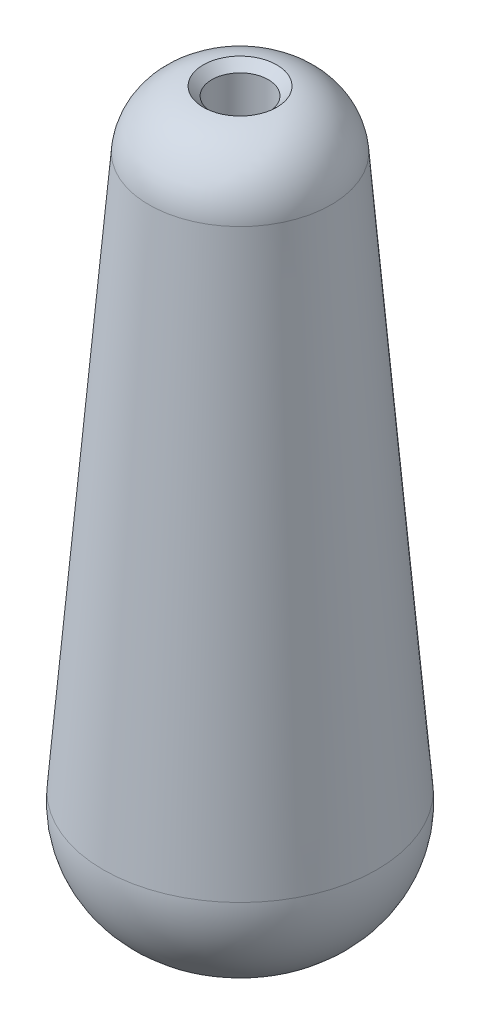
ISO-10303-21;
HEADER;
FILE_DESCRIPTION(('STEP AP214'),'2;1');
FILE_NAME('part.step','',(''),(''),'','','');
FILE_SCHEMA(('AUTOMOTIVE_DESIGN { 1 0 10303 214 1 1 1 1 }'));
ENDSEC;
DATA;
#1=APPLICATION_CONTEXT('core data for automotive mechanical design processes');
#2=APPLICATION_PROTOCOL_DEFINITION('international standard','automotive_design',2000,#1);
#3=PRODUCT_CONTEXT('',#1,'mechanical');
#4=PRODUCT('Part','Part','',(#3));
#5=PRODUCT_RELATED_PRODUCT_CATEGORY('part','',(#4));
#6=PRODUCT_DEFINITION_FORMATION('','',#4);
#7=PRODUCT_DEFINITION_CONTEXT('part definition',#1,'design');
#8=PRODUCT_DEFINITION('design','',#6,#7);
#9=PRODUCT_DEFINITION_SHAPE('','',#8);
#10=(LENGTH_UNIT() NAMED_UNIT(*) SI_UNIT(.MILLI.,.METRE.));
#11=(NAMED_UNIT(*) PLANE_ANGLE_UNIT() SI_UNIT($,.RADIAN.));
#12=(NAMED_UNIT(*) SI_UNIT($,.STERADIAN.) SOLID_ANGLE_UNIT());
#13=UNCERTAINTY_MEASURE_WITH_UNIT(LENGTH_MEASURE(1.E-05),#10,'distance_accuracy_value','');
#14=(GEOMETRIC_REPRESENTATION_CONTEXT(3) GLOBAL_UNCERTAINTY_ASSIGNED_CONTEXT((#13)) GLOBAL_UNIT_ASSIGNED_CONTEXT((#10,
#11,#12)) REPRESENTATION_CONTEXT('',''));
#15=CARTESIAN_POINT('',(0.,0.,0.));
#16=DIRECTION('',(0.,0.,1.));
#17=DIRECTION('',(1.,0.,0.));
#18=AXIS2_PLACEMENT_3D('',#15,#16,#17);
#19=CARTESIAN_POINT('',(3.1,0.,0.));
#20=DIRECTION('',(0.,-1.,0.));
#21=DIRECTION('',(0.,0.,-1.));
#22=AXIS2_PLACEMENT_3D('',#19,#20,#21);
#23=PLANE('',#22);
#24=CARTESIAN_POINT('',(0.,0.,0.));
#25=DIRECTION('',(0.,-1.,0.));
#26=DIRECTION('',(0.,0.,-1.));
#27=AXIS2_PLACEMENT_3D('',#24,#25,#26);
#28=CIRCLE('',#27,3.1);
#29=CARTESIAN_POINT('',(0.,0.,-3.1));
#30=VERTEX_POINT('',#29);
#31=EDGE_CURVE('E42',#30,#30,#28,.T.);
#32=ORIENTED_EDGE('',*,*,#31,.T.);
#33=EDGE_LOOP('',(#32));
#34=FACE_BOUND('',#33,.T.);
#35=ADVANCED_FACE('F31',(#34),#23,.T.);
#36=CARTESIAN_POINT('',(0.,11.9402709811617,0.));
#37=DIRECTION('',(0.,-1.,0.));
#38=DIRECTION('',(0.,0.,-1.));
#39=AXIS2_PLACEMENT_3D('',#36,#37,#38);
#40=DEGENERATE_TOROIDAL_SURFACE('',#39,3.1,11.9402709811617,.T.);
#41=CARTESIAN_POINT('',(0.,12.9201031624934,0.));
#42=DIRECTION('',(0.,-1.,0.));
#43=DIRECTION('',(0.,0.,-1.));
#44=AXIS2_PLACEMENT_3D('',#41,#42,#43);
#45=CIRCLE('',#44,15.);
#46=CARTESIAN_POINT('',(0.,12.9201031624934,-15.));
#47=VERTEX_POINT('',#46);
#48=EDGE_CURVE('E46',#47,#47,#45,.T.);
#49=ORIENTED_EDGE('',*,*,#48,.T.);
#50=EDGE_LOOP('',(#49));
#51=FACE_BOUND('',#50,.T.);
#52=ORIENTED_EDGE('',*,*,#31,.F.);
#53=EDGE_LOOP('',(#52));
#54=FACE_BOUND('',#53,.T.);
#55=ADVANCED_FACE('F71',(#51,#54),#40,.T.);
#56=CARTESIAN_POINT('',(0.,12.9201031624934,0.));
#57=DIRECTION('',(0.,-1.,0.));
#58=DIRECTION('',(0.,0.,-1.));
#59=AXIS2_PLACEMENT_3D('',#56,#57,#58);
#60=CONICAL_SURFACE('',#59,15.,0.0821535149347935);
#61=CARTESIAN_POINT('',(0.,73.6447875866532,0.));
#62=DIRECTION('',(0.,-1.,0.));
#63=DIRECTION('',(0.,0.,-1.));
#64=AXIS2_PLACEMENT_3D('',#61,#62,#63);
#65=CIRCLE('',#64,10.);
#66=CARTESIAN_POINT('',(0.,73.6447875866532,-10.));
#67=VERTEX_POINT('',#66);
#68=EDGE_CURVE('E51',#67,#67,#65,.T.);
#69=ORIENTED_EDGE('',*,*,#68,.T.);
#70=EDGE_LOOP('',(#69));
#71=FACE_BOUND('',#70,.T.);
#72=ORIENTED_EDGE('',*,*,#48,.F.);
#73=EDGE_LOOP('',(#72));
#74=FACE_BOUND('',#73,.T.);
#75=ADVANCED_FACE('F76',(#71,#74),#60,.T.);
#76=CARTESIAN_POINT('',(0.,73.0766495991583,0.));
#77=DIRECTION('',(0.,-1.,0.));
#78=DIRECTION('',(0.,0.,-1.));
#79=AXIS2_PLACEMENT_3D('',#76,#77,#78);
#80=DEGENERATE_TOROIDAL_SURFACE('',#79,3.1,6.92335040084168,.T.);
#81=CARTESIAN_POINT('',(0.,79.9363846238545,0.));
#82=DIRECTION('',(0.,-1.,0.));
#83=DIRECTION('',(0.,0.,-1.));
#84=AXIS2_PLACEMENT_3D('',#81,#82,#83);
#85=CIRCLE('',#84,4.0363846238545);
#86=CARTESIAN_POINT('',(0.,79.9363846238545,-4.0363846238545));
#87=VERTEX_POINT('',#86);
#88=EDGE_CURVE('E38',#87,#87,#85,.T.);
#89=ORIENTED_EDGE('',*,*,#88,.T.);
#90=EDGE_LOOP('',(#89));
#91=FACE_BOUND('',#90,.T.);
#92=ORIENTED_EDGE('',*,*,#68,.F.);
#93=EDGE_LOOP('',(#92));
#94=FACE_BOUND('',#93,.T.);
#95=ADVANCED_FACE('F68',(#91,#94),#80,.T.);
#96=CARTESIAN_POINT('',(0.,0.,0.));
#97=DIRECTION('',(0.,-1.,0.));
#98=DIRECTION('',(0.,0.,-1.));
#99=AXIS2_PLACEMENT_3D('',#96,#97,#98);
#100=CYLINDRICAL_SURFACE('',#99,3.1);
#101=CARTESIAN_POINT('',(0.,79.,0.));
#102=DIRECTION('',(0.,1.,0.));
#103=DIRECTION('',(0.,0.,1.));
#104=AXIS2_PLACEMENT_3D('',#101,#102,#103);
#105=CIRCLE('',#104,3.1);
#106=CARTESIAN_POINT('',(0.,79.,3.1));
#107=VERTEX_POINT('',#106);
#108=EDGE_CURVE('E10',#107,#107,#105,.T.);
#109=ORIENTED_EDGE('',*,*,#108,.T.);
#110=EDGE_LOOP('',(#109));
#111=FACE_BOUND('',#110,.T.);
#112=CARTESIAN_POINT('',(0.,4.,0.));
#113=DIRECTION('',(0.,-1.,0.));
#114=DIRECTION('',(0.,0.,-1.));
#115=AXIS2_PLACEMENT_3D('',#112,#113,#114);
#116=CIRCLE('',#115,3.1);
#117=CARTESIAN_POINT('',(0.,4.,-3.1));
#118=VERTEX_POINT('',#117);
#119=EDGE_CURVE('E54',#118,#118,#116,.T.);
#120=ORIENTED_EDGE('',*,*,#119,.T.);
#121=EDGE_LOOP('',(#120));
#122=FACE_BOUND('',#121,.T.);
#123=ADVANCED_FACE('F58',(#111,#122),#100,.F.);
#124=CARTESIAN_POINT('',(0.,4.,0.));
#125=DIRECTION('',(0.,1.,0.));
#126=DIRECTION('',(0.,0.,1.));
#127=AXIS2_PLACEMENT_3D('',#124,#125,#126);
#128=PLANE('',#127);
#129=ORIENTED_EDGE('',*,*,#119,.F.);
#130=EDGE_LOOP('',(#129));
#131=FACE_BOUND('',#130,.T.);
#132=ADVANCED_FACE('F60',(#131),#128,.T.);
#133=CARTESIAN_POINT('',(0.,79.9363846238545,0.));
#134=DIRECTION('',(0.,1.,0.));
#135=DIRECTION('',(0.,0.,1.));
#136=AXIS2_PLACEMENT_3D('',#133,#134,#135);
#137=CONICAL_SURFACE('',#136,4.0363846238545,0.785398163397445);
#138=ORIENTED_EDGE('',*,*,#108,.F.);
#139=EDGE_LOOP('',(#138));
#140=FACE_BOUND('',#139,.T.);
#141=ORIENTED_EDGE('',*,*,#88,.F.);
#142=EDGE_LOOP('',(#141));
#143=FACE_BOUND('',#142,.T.);
#144=ADVANCED_FACE('F33',(#140,#143),#137,.F.);
#145=CLOSED_SHELL('',(#35,#55,#75,#95,#123,#132,#144));
#146=MANIFOLD_SOLID_BREP('B2',#145);
#147=ADVANCED_BREP_SHAPE_REPRESENTATION('',(#18,#146),#14);
#148=SHAPE_DEFINITION_REPRESENTATION(#9,#147);
ENDSEC;
END-ISO-10303-21;
